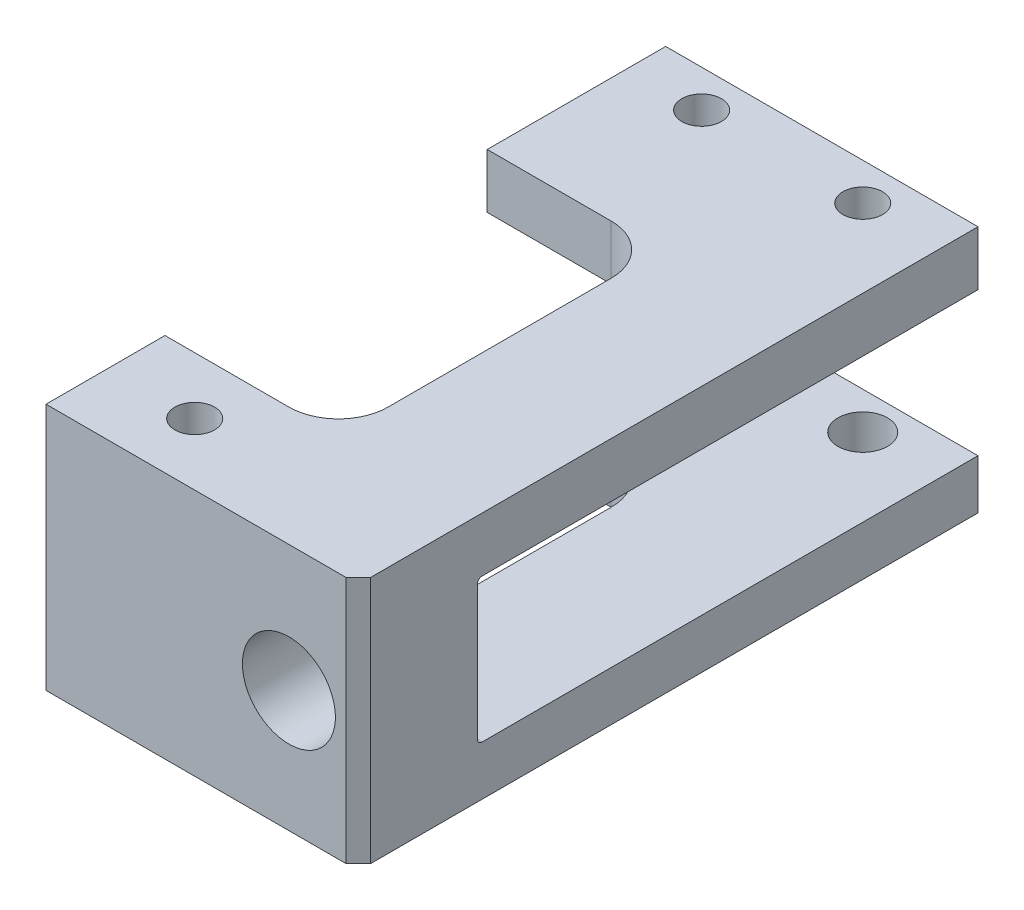
ISO-10303-21;
HEADER;
FILE_DESCRIPTION(('STEP AP214'),'2;1');
FILE_NAME('part.step','',(''),(''),'','','');
FILE_SCHEMA(('AUTOMOTIVE_DESIGN { 1 0 10303 214 1 1 1 1 }'));
ENDSEC;
DATA;
#1=APPLICATION_CONTEXT('core data for automotive mechanical design processes');
#2=APPLICATION_PROTOCOL_DEFINITION('international standard','automotive_design',2000,#1);
#3=PRODUCT_CONTEXT('',#1,'mechanical');
#4=PRODUCT('Part','Part','',(#3));
#5=PRODUCT_RELATED_PRODUCT_CATEGORY('part','',(#4));
#6=PRODUCT_DEFINITION_FORMATION('','',#4);
#7=PRODUCT_DEFINITION_CONTEXT('part definition',#1,'design');
#8=PRODUCT_DEFINITION('design','',#6,#7);
#9=PRODUCT_DEFINITION_SHAPE('','',#8);
#10=(LENGTH_UNIT() NAMED_UNIT(*) SI_UNIT(.MILLI.,.METRE.));
#11=(NAMED_UNIT(*) PLANE_ANGLE_UNIT() SI_UNIT($,.RADIAN.));
#12=(NAMED_UNIT(*) SI_UNIT($,.STERADIAN.) SOLID_ANGLE_UNIT());
#13=UNCERTAINTY_MEASURE_WITH_UNIT(LENGTH_MEASURE(1.E-05),#10,'distance_accuracy_value','');
#14=(GEOMETRIC_REPRESENTATION_CONTEXT(3) GLOBAL_UNCERTAINTY_ASSIGNED_CONTEXT((#13)) GLOBAL_UNIT_ASSIGNED_CONTEXT((#10,
#11,#12)) REPRESENTATION_CONTEXT('',''));
#15=CARTESIAN_POINT('',(0.,0.,0.));
#16=DIRECTION('',(0.,0.,1.));
#17=DIRECTION('',(1.,0.,0.));
#18=AXIS2_PLACEMENT_3D('',#15,#16,#17);
#19=CARTESIAN_POINT('',(-2.8,10.,10.));
#20=DIRECTION('',(0.,1.,0.));
#21=DIRECTION('',(0.,0.,1.));
#22=AXIS2_PLACEMENT_3D('',#19,#20,#21);
#23=CYLINDRICAL_SURFACE('',#22,0.799999999999999);
#24=CARTESIAN_POINT('',(-2.8,10.,10.));
#25=DIRECTION('',(0.,1.,0.));
#26=DIRECTION('',(0.,0.,1.));
#27=AXIS2_PLACEMENT_3D('',#24,#25,#26);
#28=CIRCLE('',#27,0.799999999999999);
#29=CARTESIAN_POINT('',(-2.8,10.,10.8));
#30=VERTEX_POINT('',#29);
#31=EDGE_CURVE('E418',#30,#30,#28,.T.);
#32=ORIENTED_EDGE('',*,*,#31,.T.);
#33=EDGE_LOOP('',(#32));
#34=FACE_BOUND('',#33,.T.);
#35=CARTESIAN_POINT('',(-2.8,0.999999999999999,10.));
#36=DIRECTION('',(0.,-1.,0.));
#37=DIRECTION('',(0.,0.,-1.));
#38=AXIS2_PLACEMENT_3D('',#35,#36,#37);
#39=CIRCLE('',#38,0.799999999999999);
#40=CARTESIAN_POINT('',(-2.8,0.999999999999999,9.2));
#41=VERTEX_POINT('',#40);
#42=EDGE_CURVE('E42',#41,#41,#39,.F.);
#43=ORIENTED_EDGE('',*,*,#42,.F.);
#44=EDGE_LOOP('',(#43));
#45=FACE_BOUND('',#44,.T.);
#46=ADVANCED_FACE('F37',(#34,#45),#23,.F.);
#47=CARTESIAN_POINT('',(-6.3,10.,12.5));
#48=DIRECTION('',(1.,0.,0.));
#49=DIRECTION('',(0.,0.,-1.));
#50=AXIS2_PLACEMENT_3D('',#47,#48,#49);
#51=PLANE('',#50);
#52=DIRECTION('',(0.,0.,1.));
#53=VECTOR('',#52,1.);
#54=CARTESIAN_POINT('',(-6.3,10.,12.5));
#55=LINE('',#54,#53);
#56=CARTESIAN_POINT('',(-6.3,10.,7.7));
#57=VERTEX_POINT('',#56);
#58=CARTESIAN_POINT('',(-6.3,10.,12.5));
#59=VERTEX_POINT('',#58);
#60=EDGE_CURVE('E210',#57,#59,#55,.T.);
#61=ORIENTED_EDGE('',*,*,#60,.F.);
#62=DIRECTION('',(0.,-1.,0.));
#63=VECTOR('',#62,1.);
#64=CARTESIAN_POINT('',(-6.3,7.8,7.7));
#65=LINE('',#64,#63);
#66=CARTESIAN_POINT('',(-6.3,0.,7.7));
#67=VERTEX_POINT('',#66);
#68=EDGE_CURVE('E475',#57,#67,#65,.T.);
#69=ORIENTED_EDGE('',*,*,#68,.T.);
#70=DIRECTION('',(0.,0.,1.));
#71=VECTOR('',#70,1.);
#72=CARTESIAN_POINT('',(-6.3,0.,12.5));
#73=LINE('',#72,#71);
#74=CARTESIAN_POINT('',(-6.3,0.,12.5));
#75=VERTEX_POINT('',#74);
#76=EDGE_CURVE('E222',#67,#75,#73,.T.);
#77=ORIENTED_EDGE('',*,*,#76,.T.);
#78=DIRECTION('',(0.,-1.,0.));
#79=VECTOR('',#78,1.);
#80=CARTESIAN_POINT('',(-6.3,10.,12.5));
#81=LINE('',#80,#79);
#82=EDGE_CURVE('E212',#59,#75,#81,.T.);
#83=ORIENTED_EDGE('',*,*,#82,.F.);
#84=EDGE_LOOP('',(#61,#69,#77,#83));
#85=FACE_BOUND('',#84,.T.);
#86=ADVANCED_FACE('F346',(#85),#51,.F.);
#87=CARTESIAN_POINT('',(-6.3,0.,-12.5));
#88=VERTEX_POINT('',#87);
#89=CARTESIAN_POINT('',(-6.3,0.,-5.3));
#90=VERTEX_POINT('',#89);
#91=EDGE_CURVE('E223',#88,#90,#73,.T.);
#92=ORIENTED_EDGE('',*,*,#91,.T.);
#93=DIRECTION('',(0.,1.,0.));
#94=VECTOR('',#93,1.);
#95=CARTESIAN_POINT('',(-6.3,0.,-5.3));
#96=LINE('',#95,#94);
#97=CARTESIAN_POINT('',(-6.3,2.,-5.3));
#98=VERTEX_POINT('',#97);
#99=EDGE_CURVE('E202',#90,#98,#96,.T.);
#100=ORIENTED_EDGE('',*,*,#99,.T.);
#101=DIRECTION('',(0.,0.,1.));
#102=VECTOR('',#101,1.);
#103=CARTESIAN_POINT('',(-6.3,2.,-12.5));
#104=LINE('',#103,#102);
#105=CARTESIAN_POINT('',(-6.3,2.,-12.5));
#106=VERTEX_POINT('',#105);
#107=EDGE_CURVE('E481',#106,#98,#104,.T.);
#108=ORIENTED_EDGE('',*,*,#107,.F.);
#109=DIRECTION('',(0.,-1.,0.));
#110=VECTOR('',#109,1.);
#111=CARTESIAN_POINT('',(-6.3,10.,-12.5));
#112=LINE('',#111,#110);
#113=EDGE_CURVE('E231',#106,#88,#112,.T.);
#114=ORIENTED_EDGE('',*,*,#113,.T.);
#115=EDGE_LOOP('',(#92,#100,#108,#114));
#116=FACE_BOUND('',#115,.T.);
#117=ADVANCED_FACE('F347',(#116),#51,.F.);
#118=CARTESIAN_POINT('',(-6.3,10.,-12.5));
#119=DIRECTION('',(0.,0.,1.));
#120=DIRECTION('',(1.,0.,0.));
#121=AXIS2_PLACEMENT_3D('',#118,#119,#120);
#122=PLANE('',#121);
#123=DIRECTION('',(0.,-1.,0.));
#124=VECTOR('',#123,1.);
#125=CARTESIAN_POINT('',(6.3,10.,-12.5));
#126=LINE('',#125,#124);
#127=CARTESIAN_POINT('',(6.3,10.,-12.5));
#128=VERTEX_POINT('',#127);
#129=CARTESIAN_POINT('',(6.3,7.8,-12.5));
#130=VERTEX_POINT('',#129);
#131=EDGE_CURVE('E235',#128,#130,#126,.T.);
#132=ORIENTED_EDGE('',*,*,#131,.T.);
#133=DIRECTION('',(-1.,0.,0.));
#134=VECTOR('',#133,1.);
#135=CARTESIAN_POINT('',(-6.3,7.8,-12.5));
#136=LINE('',#135,#134);
#137=CARTESIAN_POINT('',(-6.3,7.8,-12.5));
#138=VERTEX_POINT('',#137);
#139=EDGE_CURVE('E478',#130,#138,#136,.T.);
#140=ORIENTED_EDGE('',*,*,#139,.T.);
#141=CARTESIAN_POINT('',(-6.3,10.,-12.5));
#142=VERTEX_POINT('',#141);
#143=EDGE_CURVE('E232',#142,#138,#112,.T.);
#144=ORIENTED_EDGE('',*,*,#143,.F.);
#145=DIRECTION('',(-1.,0.,0.));
#146=VECTOR('',#145,1.);
#147=CARTESIAN_POINT('',(-6.3,10.,-12.5));
#148=LINE('',#147,#146);
#149=EDGE_CURVE('E207',#128,#142,#148,.T.);
#150=ORIENTED_EDGE('',*,*,#149,.F.);
#151=EDGE_LOOP('',(#132,#140,#144,#150));
#152=FACE_BOUND('',#151,.T.);
#153=ADVANCED_FACE('F338',(#152),#122,.F.);
#154=CARTESIAN_POINT('',(6.3,10.,12.5));
#155=DIRECTION('',(-1.,0.,0.));
#156=DIRECTION('',(0.,0.,1.));
#157=AXIS2_PLACEMENT_3D('',#154,#155,#156);
#158=PLANE('',#157);
#159=DIRECTION('',(0.,0.,-1.));
#160=VECTOR('',#159,1.);
#161=CARTESIAN_POINT('',(6.3,10.,12.5));
#162=LINE('',#161,#160);
#163=CARTESIAN_POINT('',(6.3,10.,12.));
#164=VERTEX_POINT('',#163);
#165=EDGE_CURVE('E228',#164,#128,#162,.T.);
#166=ORIENTED_EDGE('',*,*,#165,.F.);
#167=DIRECTION('',(0.,-1.,0.));
#168=VECTOR('',#167,1.);
#169=CARTESIAN_POINT('',(6.3,10.,12.));
#170=LINE('',#169,#168);
#171=CARTESIAN_POINT('',(6.3,0.,12.));
#172=VERTEX_POINT('',#171);
#173=EDGE_CURVE('E513',#164,#172,#170,.T.);
#174=ORIENTED_EDGE('',*,*,#173,.T.);
#175=DIRECTION('',(0.,0.,-1.));
#176=VECTOR('',#175,1.);
#177=CARTESIAN_POINT('',(6.3,0.,12.5));
#178=LINE('',#177,#176);
#179=CARTESIAN_POINT('',(6.3,0.,-12.5));
#180=VERTEX_POINT('',#179);
#181=EDGE_CURVE('E217',#172,#180,#178,.T.);
#182=ORIENTED_EDGE('',*,*,#181,.T.);
#183=CARTESIAN_POINT('',(6.3,2.,-12.5));
#184=VERTEX_POINT('',#183);
#185=EDGE_CURVE('E234',#184,#180,#126,.T.);
#186=ORIENTED_EDGE('',*,*,#185,.F.);
#187=DIRECTION('',(0.,0.,1.));
#188=VECTOR('',#187,1.);
#189=CARTESIAN_POINT('',(6.3,2.,-12.5));
#190=LINE('',#189,#188);
#191=CARTESIAN_POINT('',(6.3,2.,7.5));
#192=VERTEX_POINT('',#191);
#193=EDGE_CURVE('E459',#184,#192,#190,.T.);
#194=ORIENTED_EDGE('',*,*,#193,.T.);
#195=CARTESIAN_POINT('',(6.3,2.2,7.5));
#196=DIRECTION('',(-1.,0.,0.));
#197=DIRECTION('',(0.,0.,1.));
#198=AXIS2_PLACEMENT_3D('',#195,#196,#197);
#199=CIRCLE('',#198,0.2);
#200=CARTESIAN_POINT('',(6.3,2.2,7.7));
#201=VERTEX_POINT('',#200);
#202=EDGE_CURVE('E296',#192,#201,#199,.T.);
#203=ORIENTED_EDGE('',*,*,#202,.T.);
#204=DIRECTION('',(0.,1.,0.));
#205=VECTOR('',#204,1.);
#206=CARTESIAN_POINT('',(6.3,2.,7.7));
#207=LINE('',#206,#205);
#208=CARTESIAN_POINT('',(6.3,7.6,7.7));
#209=VERTEX_POINT('',#208);
#210=EDGE_CURVE('E470',#201,#209,#207,.T.);
#211=ORIENTED_EDGE('',*,*,#210,.T.);
#212=CARTESIAN_POINT('',(6.3,7.6,7.5));
#213=DIRECTION('',(-1.,0.,0.));
#214=DIRECTION('',(0.,0.,1.));
#215=AXIS2_PLACEMENT_3D('',#212,#213,#214);
#216=CIRCLE('',#215,0.2);
#217=CARTESIAN_POINT('',(6.3,7.8,7.5));
#218=VERTEX_POINT('',#217);
#219=EDGE_CURVE('E494',#209,#218,#216,.T.);
#220=ORIENTED_EDGE('',*,*,#219,.T.);
#221=DIRECTION('',(0.,0.,-1.));
#222=VECTOR('',#221,1.);
#223=CARTESIAN_POINT('',(6.3,7.8,-12.5));
#224=LINE('',#223,#222);
#225=EDGE_CURVE('E473',#218,#130,#224,.T.);
#226=ORIENTED_EDGE('',*,*,#225,.T.);
#227=ORIENTED_EDGE('',*,*,#131,.F.);
#228=EDGE_LOOP('',(#166,#174,#182,#186,#194,#203,#211,#220,#226,#227));
#229=FACE_BOUND('',#228,.T.);
#230=ADVANCED_FACE('F334',(#229),#158,.F.);
#231=DIRECTION('',(1.,0.,0.));
#232=VECTOR('',#231,1.);
#233=CARTESIAN_POINT('',(-6.3,2.,-12.5));
#234=LINE('',#233,#232);
#235=EDGE_CURVE('E476',#106,#184,#234,.T.);
#236=ORIENTED_EDGE('',*,*,#235,.T.);
#237=ORIENTED_EDGE('',*,*,#185,.T.);
#238=DIRECTION('',(-1.,0.,0.));
#239=VECTOR('',#238,1.);
#240=CARTESIAN_POINT('',(-6.3,0.,-12.5));
#241=LINE('',#240,#239);
#242=EDGE_CURVE('E219',#180,#88,#241,.T.);
#243=ORIENTED_EDGE('',*,*,#242,.T.);
#244=ORIENTED_EDGE('',*,*,#113,.F.);
#245=EDGE_LOOP('',(#236,#237,#243,#244));
#246=FACE_BOUND('',#245,.T.);
#247=ADVANCED_FACE('F337',(#246),#122,.F.);
#248=DIRECTION('',(0.,0.,1.));
#249=VECTOR('',#248,1.);
#250=CARTESIAN_POINT('',(-6.3,7.8,-12.5));
#251=LINE('',#250,#249);
#252=CARTESIAN_POINT('',(-6.3,7.8,-5.3));
#253=VERTEX_POINT('',#252);
#254=EDGE_CURVE('E201',#138,#253,#251,.T.);
#255=ORIENTED_EDGE('',*,*,#254,.T.);
#256=CARTESIAN_POINT('',(-6.3,10.,-5.3));
#257=VERTEX_POINT('',#256);
#258=EDGE_CURVE('E187',#253,#257,#96,.T.);
#259=ORIENTED_EDGE('',*,*,#258,.T.);
#260=EDGE_CURVE('E200',#142,#257,#55,.T.);
#261=ORIENTED_EDGE('',*,*,#260,.F.);
#262=ORIENTED_EDGE('',*,*,#143,.T.);
#263=EDGE_LOOP('',(#255,#259,#261,#262));
#264=FACE_BOUND('',#263,.T.);
#265=ADVANCED_FACE('F198',(#264),#51,.F.);
#266=CARTESIAN_POINT('',(-6.3,10.,12.5));
#267=DIRECTION('',(0.,0.,-1.));
#268=DIRECTION('',(-1.,0.,0.));
#269=AXIS2_PLACEMENT_3D('',#266,#267,#268);
#270=PLANE('',#269);
#271=CARTESIAN_POINT('',(3.5,4.9,12.5));
#272=DIRECTION('',(0.,0.,-1.));
#273=DIRECTION('',(-1.,0.,0.));
#274=AXIS2_PLACEMENT_3D('',#271,#272,#273);
#275=CIRCLE('',#274,1.875);
#276=CARTESIAN_POINT('',(1.625,4.9,12.5));
#277=VERTEX_POINT('',#276);
#278=EDGE_CURVE('E427',#277,#277,#275,.T.);
#279=ORIENTED_EDGE('',*,*,#278,.T.);
#280=EDGE_LOOP('',(#279));
#281=FACE_BOUND('',#280,.T.);
#282=DIRECTION('',(1.,0.,0.));
#283=VECTOR('',#282,1.);
#284=CARTESIAN_POINT('',(-6.3,0.,12.5));
#285=LINE('',#284,#283);
#286=CARTESIAN_POINT('',(5.8,0.,12.5));
#287=VERTEX_POINT('',#286);
#288=EDGE_CURVE('E226',#75,#287,#285,.T.);
#289=ORIENTED_EDGE('',*,*,#288,.T.);
#290=DIRECTION('',(0.,1.,0.));
#291=VECTOR('',#290,1.);
#292=CARTESIAN_POINT('',(5.8,10.,12.5));
#293=LINE('',#292,#291);
#294=CARTESIAN_POINT('',(5.8,10.,12.5));
#295=VERTEX_POINT('',#294);
#296=EDGE_CURVE('E47',#287,#295,#293,.T.);
#297=ORIENTED_EDGE('',*,*,#296,.T.);
#298=DIRECTION('',(1.,0.,0.));
#299=VECTOR('',#298,1.);
#300=CARTESIAN_POINT('',(-6.3,10.,12.5));
#301=LINE('',#300,#299);
#302=EDGE_CURVE('E209',#59,#295,#301,.T.);
#303=ORIENTED_EDGE('',*,*,#302,.F.);
#304=ORIENTED_EDGE('',*,*,#82,.T.);
#305=EDGE_LOOP('',(#289,#297,#303,#304));
#306=FACE_BOUND('',#305,.T.);
#307=ADVANCED_FACE('F345',(#281,#306),#270,.F.);
#308=CARTESIAN_POINT('',(0.,10.,0.));
#309=DIRECTION('',(0.,-1.,0.));
#310=DIRECTION('',(0.,0.,-1.));
#311=AXIS2_PLACEMENT_3D('',#308,#309,#310);
#312=PLANE('',#311);
#313=ORIENTED_EDGE('',*,*,#31,.F.);
#314=EDGE_LOOP('',(#313));
#315=FACE_BOUND('',#314,.T.);
#316=CARTESIAN_POINT('',(3.15,10.,-11.));
#317=DIRECTION('',(0.,1.,0.));
#318=DIRECTION('',(0.,0.,1.));
#319=AXIS2_PLACEMENT_3D('',#316,#317,#318);
#320=CIRCLE('',#319,0.799999999999988);
#321=CARTESIAN_POINT('',(3.15,10.,-10.2));
#322=VERTEX_POINT('',#321);
#323=EDGE_CURVE('E247',#322,#322,#320,.T.);
#324=ORIENTED_EDGE('',*,*,#323,.F.);
#325=EDGE_LOOP('',(#324));
#326=FACE_BOUND('',#325,.T.);
#327=CARTESIAN_POINT('',(-3.35,10.,-11.));
#328=DIRECTION('',(0.,1.,0.));
#329=DIRECTION('',(0.,0.,1.));
#330=AXIS2_PLACEMENT_3D('',#327,#328,#329);
#331=CIRCLE('',#330,0.799999999999988);
#332=CARTESIAN_POINT('',(-3.35,10.,-10.2));
#333=VERTEX_POINT('',#332);
#334=EDGE_CURVE('E243',#333,#333,#331,.T.);
#335=ORIENTED_EDGE('',*,*,#334,.F.);
#336=EDGE_LOOP('',(#335));
#337=FACE_BOUND('',#336,.T.);
#338=ORIENTED_EDGE('',*,*,#302,.T.);
#339=DIRECTION('',(-0.707106781186548,0.,0.707106781186548));
#340=VECTOR('',#339,1.);
#341=CARTESIAN_POINT('',(6.3,10.,12.));
#342=LINE('',#341,#340);
#343=EDGE_CURVE('E11',#295,#164,#342,.F.);
#344=ORIENTED_EDGE('',*,*,#343,.T.);
#345=ORIENTED_EDGE('',*,*,#165,.T.);
#346=ORIENTED_EDGE('',*,*,#149,.T.);
#347=ORIENTED_EDGE('',*,*,#260,.T.);
#348=DIRECTION('',(-1.,0.,0.));
#349=VECTOR('',#348,1.);
#350=CARTESIAN_POINT('',(0.700000000000002,10.,-5.3));
#351=LINE('',#350,#349);
#352=CARTESIAN_POINT('',(-1.3,10.,-5.3));
#353=VERTEX_POINT('',#352);
#354=EDGE_CURVE('E183',#353,#257,#351,.T.);
#355=ORIENTED_EDGE('',*,*,#354,.F.);
#356=CARTESIAN_POINT('',(-1.3,10.,-3.3));
#357=DIRECTION('',(0.,-1.,0.));
#358=DIRECTION('',(0.,0.,-1.));
#359=AXIS2_PLACEMENT_3D('',#356,#357,#358);
#360=CIRCLE('',#359,2.);
#361=CARTESIAN_POINT('',(0.700000000000002,10.,-3.29999999999999));
#362=VERTEX_POINT('',#361);
#363=EDGE_CURVE('E268',#353,#362,#360,.T.);
#364=ORIENTED_EDGE('',*,*,#363,.T.);
#365=DIRECTION('',(0.,0.,-1.));
#366=VECTOR('',#365,1.);
#367=CARTESIAN_POINT('',(0.700000000000001,10.,7.7));
#368=LINE('',#367,#366);
#369=CARTESIAN_POINT('',(0.700000000000001,10.,5.7));
#370=VERTEX_POINT('',#369);
#371=EDGE_CURVE('E194',#370,#362,#368,.T.);
#372=ORIENTED_EDGE('',*,*,#371,.F.);
#373=CARTESIAN_POINT('',(-1.3,10.,5.7));
#374=DIRECTION('',(0.,-1.,0.));
#375=DIRECTION('',(0.,0.,-1.));
#376=AXIS2_PLACEMENT_3D('',#373,#374,#375);
#377=CIRCLE('',#376,2.);
#378=CARTESIAN_POINT('',(-1.3,10.,7.7));
#379=VERTEX_POINT('',#378);
#380=EDGE_CURVE('E272',#370,#379,#377,.T.);
#381=ORIENTED_EDGE('',*,*,#380,.T.);
#382=DIRECTION('',(1.,0.,0.));
#383=VECTOR('',#382,1.);
#384=CARTESIAN_POINT('',(0.700000000000001,10.,7.7));
#385=LINE('',#384,#383);
#386=EDGE_CURVE('E193',#57,#379,#385,.T.);
#387=ORIENTED_EDGE('',*,*,#386,.F.);
#388=ORIENTED_EDGE('',*,*,#60,.T.);
#389=EDGE_LOOP('',(#338,#344,#345,#346,#347,#355,#364,#372,#381,#387,#388));
#390=FACE_BOUND('',#389,.T.);
#391=ADVANCED_FACE('F205',(#315,#326,#337,#390),#312,.F.);
#392=CARTESIAN_POINT('',(0.,0.,0.));
#393=DIRECTION('',(0.,-1.,0.));
#394=DIRECTION('',(0.,0.,-1.));
#395=AXIS2_PLACEMENT_3D('',#392,#393,#394);
#396=PLANE('',#395);
#397=CARTESIAN_POINT('',(-2.8,0.,10.));
#398=DIRECTION('',(0.,-1.,0.));
#399=DIRECTION('',(0.,0.,-1.));
#400=AXIS2_PLACEMENT_3D('',#397,#398,#399);
#401=CIRCLE('',#400,1.5);
#402=CARTESIAN_POINT('',(-2.8,0.,8.5));
#403=VERTEX_POINT('',#402);
#404=EDGE_CURVE('E422',#403,#403,#401,.T.);
#405=ORIENTED_EDGE('',*,*,#404,.F.);
#406=EDGE_LOOP('',(#405));
#407=FACE_BOUND('',#406,.T.);
#408=ORIENTED_EDGE('',*,*,#181,.F.);
#409=DIRECTION('',(0.707106781186548,0.,-0.707106781186548));
#410=VECTOR('',#409,1.);
#411=CARTESIAN_POINT('',(9.15,0.,9.15));
#412=LINE('',#411,#410);
#413=EDGE_CURVE('E61',#172,#287,#412,.F.);
#414=ORIENTED_EDGE('',*,*,#413,.T.);
#415=ORIENTED_EDGE('',*,*,#288,.F.);
#416=ORIENTED_EDGE('',*,*,#76,.F.);
#417=DIRECTION('',(1.,0.,0.));
#418=VECTOR('',#417,1.);
#419=CARTESIAN_POINT('',(0.700000000000001,0.,7.7));
#420=LINE('',#419,#418);
#421=CARTESIAN_POINT('',(-1.3,0.,7.7));
#422=VERTEX_POINT('',#421);
#423=EDGE_CURVE('E203',#67,#422,#420,.T.);
#424=ORIENTED_EDGE('',*,*,#423,.T.);
#425=CARTESIAN_POINT('',(-1.3,0.,5.7));
#426=DIRECTION('',(0.,-1.,0.));
#427=DIRECTION('',(0.,0.,-1.));
#428=AXIS2_PLACEMENT_3D('',#425,#426,#427);
#429=CIRCLE('',#428,2.);
#430=CARTESIAN_POINT('',(0.700000000000001,0.,5.7));
#431=VERTEX_POINT('',#430);
#432=EDGE_CURVE('E283',#422,#431,#429,.F.);
#433=ORIENTED_EDGE('',*,*,#432,.T.);
#434=DIRECTION('',(0.,0.,-1.));
#435=VECTOR('',#434,1.);
#436=CARTESIAN_POINT('',(0.700000000000001,0.,7.7));
#437=LINE('',#436,#435);
#438=CARTESIAN_POINT('',(0.700000000000002,0.,-3.29999999999999));
#439=VERTEX_POINT('',#438);
#440=EDGE_CURVE('E436',#431,#439,#437,.T.);
#441=ORIENTED_EDGE('',*,*,#440,.T.);
#442=CARTESIAN_POINT('',(-1.3,0.,-3.3));
#443=DIRECTION('',(0.,-1.,0.));
#444=DIRECTION('',(0.,0.,-1.));
#445=AXIS2_PLACEMENT_3D('',#442,#443,#444);
#446=CIRCLE('',#445,2.);
#447=CARTESIAN_POINT('',(-1.3,0.,-5.3));
#448=VERTEX_POINT('',#447);
#449=EDGE_CURVE('E278',#439,#448,#446,.F.);
#450=ORIENTED_EDGE('',*,*,#449,.T.);
#451=DIRECTION('',(-1.,0.,0.));
#452=VECTOR('',#451,1.);
#453=CARTESIAN_POINT('',(0.700000000000002,0.,-5.3));
#454=LINE('',#453,#452);
#455=EDGE_CURVE('E439',#448,#90,#454,.T.);
#456=ORIENTED_EDGE('',*,*,#455,.T.);
#457=ORIENTED_EDGE('',*,*,#91,.F.);
#458=ORIENTED_EDGE('',*,*,#242,.F.);
#459=EDGE_LOOP('',(#408,#414,#415,#416,#424,#433,#441,#450,#456,#457,#458));
#460=FACE_BOUND('',#459,.T.);
#461=CARTESIAN_POINT('',(3.15,0.,-11.));
#462=DIRECTION('',(0.,1.,0.));
#463=DIRECTION('',(0.,0.,1.));
#464=AXIS2_PLACEMENT_3D('',#461,#462,#463);
#465=CIRCLE('',#464,1.);
#466=CARTESIAN_POINT('',(3.15,0.,-10.));
#467=VERTEX_POINT('',#466);
#468=EDGE_CURVE('E456',#467,#467,#465,.T.);
#469=ORIENTED_EDGE('',*,*,#468,.T.);
#470=EDGE_LOOP('',(#469));
#471=FACE_BOUND('',#470,.T.);
#472=CARTESIAN_POINT('',(-3.35,0.,-11.));
#473=DIRECTION('',(0.,1.,0.));
#474=DIRECTION('',(0.,0.,1.));
#475=AXIS2_PLACEMENT_3D('',#472,#473,#474);
#476=CIRCLE('',#475,1.);
#477=CARTESIAN_POINT('',(-3.35,0.,-10.));
#478=VERTEX_POINT('',#477);
#479=EDGE_CURVE('E463',#478,#478,#476,.T.);
#480=ORIENTED_EDGE('',*,*,#479,.T.);
#481=EDGE_LOOP('',(#480));
#482=FACE_BOUND('',#481,.T.);
#483=ADVANCED_FACE('F351',(#407,#460,#471,#482),#396,.T.);
#484=CARTESIAN_POINT('',(-6.3,7.8,-12.5));
#485=DIRECTION('',(0.,1.,0.));
#486=DIRECTION('',(0.,0.,1.));
#487=AXIS2_PLACEMENT_3D('',#484,#485,#486);
#488=PLANE('',#487);
#489=CARTESIAN_POINT('',(3.15,7.8,-11.));
#490=DIRECTION('',(0.,1.,0.));
#491=DIRECTION('',(0.,0.,1.));
#492=AXIS2_PLACEMENT_3D('',#489,#490,#491);
#493=CIRCLE('',#492,0.799999999999993);
#494=CARTESIAN_POINT('',(3.15,7.8,-10.2));
#495=VERTEX_POINT('',#494);
#496=EDGE_CURVE('E244',#495,#495,#493,.T.);
#497=ORIENTED_EDGE('',*,*,#496,.T.);
#498=EDGE_LOOP('',(#497));
#499=FACE_BOUND('',#498,.T.);
#500=CARTESIAN_POINT('',(-3.35,7.8,-11.));
#501=DIRECTION('',(0.,1.,0.));
#502=DIRECTION('',(0.,0.,1.));
#503=AXIS2_PLACEMENT_3D('',#500,#501,#502);
#504=CIRCLE('',#503,0.799999999999993);
#505=CARTESIAN_POINT('',(-3.35,7.8,-10.2));
#506=VERTEX_POINT('',#505);
#507=EDGE_CURVE('E239',#506,#506,#504,.T.);
#508=ORIENTED_EDGE('',*,*,#507,.T.);
#509=EDGE_LOOP('',(#508));
#510=FACE_BOUND('',#509,.T.);
#511=ORIENTED_EDGE('',*,*,#225,.F.);
#512=DIRECTION('',(-1.,0.,0.));
#513=VECTOR('',#512,1.);
#514=CARTESIAN_POINT('',(-1.3,7.8,7.5));
#515=LINE('',#514,#513);
#516=CARTESIAN_POINT('',(-0.428220211291869,7.8,7.5));
#517=VERTEX_POINT('',#516);
#518=EDGE_CURVE('E293',#218,#517,#515,.T.);
#519=ORIENTED_EDGE('',*,*,#518,.T.);
#520=CARTESIAN_POINT('',(-1.3,7.8,5.7));
#521=DIRECTION('',(0.,1.,0.));
#522=DIRECTION('',(0.,0.,1.));
#523=AXIS2_PLACEMENT_3D('',#520,#521,#522);
#524=CIRCLE('',#523,2.);
#525=CARTESIAN_POINT('',(0.700000000000001,7.8,5.7));
#526=VERTEX_POINT('',#525);
#527=EDGE_CURVE('E274',#517,#526,#524,.T.);
#528=ORIENTED_EDGE('',*,*,#527,.T.);
#529=DIRECTION('',(0.,0.,-1.));
#530=VECTOR('',#529,1.);
#531=CARTESIAN_POINT('',(0.700000000000002,7.8,-12.5));
#532=LINE('',#531,#530);
#533=CARTESIAN_POINT('',(0.700000000000001,7.8,-3.3));
#534=VERTEX_POINT('',#533);
#535=EDGE_CURVE('E447',#526,#534,#532,.T.);
#536=ORIENTED_EDGE('',*,*,#535,.T.);
#537=CARTESIAN_POINT('',(-1.3,7.8,-3.3));
#538=DIRECTION('',(0.,1.,0.));
#539=DIRECTION('',(0.,0.,1.));
#540=AXIS2_PLACEMENT_3D('',#537,#538,#539);
#541=CIRCLE('',#540,2.);
#542=CARTESIAN_POINT('',(-1.3,7.8,-5.3));
#543=VERTEX_POINT('',#542);
#544=EDGE_CURVE('E270',#534,#543,#541,.T.);
#545=ORIENTED_EDGE('',*,*,#544,.T.);
#546=DIRECTION('',(-1.,0.,0.));
#547=VECTOR('',#546,1.);
#548=CARTESIAN_POINT('',(-6.3,7.8,-5.3));
#549=LINE('',#548,#547);
#550=EDGE_CURVE('E450',#543,#253,#549,.T.);
#551=ORIENTED_EDGE('',*,*,#550,.T.);
#552=ORIENTED_EDGE('',*,*,#254,.F.);
#553=ORIENTED_EDGE('',*,*,#139,.F.);
#554=EDGE_LOOP('',(#511,#519,#528,#536,#545,#551,#552,#553));
#555=FACE_BOUND('',#554,.T.);
#556=ADVANCED_FACE('F354',(#499,#510,#555),#488,.F.);
#557=CARTESIAN_POINT('',(-6.3,2.,-12.5));
#558=DIRECTION('',(0.,-1.,0.));
#559=DIRECTION('',(0.,0.,-1.));
#560=AXIS2_PLACEMENT_3D('',#557,#558,#559);
#561=PLANE('',#560);
#562=CARTESIAN_POINT('',(3.15,2.,-11.));
#563=DIRECTION('',(0.,1.,0.));
#564=DIRECTION('',(0.,0.,1.));
#565=AXIS2_PLACEMENT_3D('',#562,#563,#564);
#566=CIRCLE('',#565,1.);
#567=CARTESIAN_POINT('',(3.15,2.,-10.));
#568=VERTEX_POINT('',#567);
#569=EDGE_CURVE('E460',#568,#568,#566,.T.);
#570=ORIENTED_EDGE('',*,*,#569,.F.);
#571=EDGE_LOOP('',(#570));
#572=FACE_BOUND('',#571,.T.);
#573=CARTESIAN_POINT('',(-3.35,2.,-11.));
#574=DIRECTION('',(0.,1.,0.));
#575=DIRECTION('',(0.,0.,1.));
#576=AXIS2_PLACEMENT_3D('',#573,#574,#575);
#577=CIRCLE('',#576,1.);
#578=CARTESIAN_POINT('',(-3.35,2.,-10.));
#579=VERTEX_POINT('',#578);
#580=EDGE_CURVE('E242',#579,#579,#577,.T.);
#581=ORIENTED_EDGE('',*,*,#580,.F.);
#582=EDGE_LOOP('',(#581));
#583=FACE_BOUND('',#582,.T.);
#584=CARTESIAN_POINT('',(-1.3,2.,5.7));
#585=DIRECTION('',(0.,-1.,0.));
#586=DIRECTION('',(0.,0.,-1.));
#587=AXIS2_PLACEMENT_3D('',#584,#585,#586);
#588=CIRCLE('',#587,2.);
#589=CARTESIAN_POINT('',(0.700000000000001,2.,5.7));
#590=VERTEX_POINT('',#589);
#591=CARTESIAN_POINT('',(-0.428220211291869,2.,7.5));
#592=VERTEX_POINT('',#591);
#593=EDGE_CURVE('E280',#590,#592,#588,.T.);
#594=ORIENTED_EDGE('',*,*,#593,.T.);
#595=DIRECTION('',(1.,0.,0.));
#596=VECTOR('',#595,1.);
#597=CARTESIAN_POINT('',(6.3,2.,7.5));
#598=LINE('',#597,#596);
#599=EDGE_CURVE('E285',#592,#192,#598,.T.);
#600=ORIENTED_EDGE('',*,*,#599,.T.);
#601=ORIENTED_EDGE('',*,*,#193,.F.);
#602=ORIENTED_EDGE('',*,*,#235,.F.);
#603=ORIENTED_EDGE('',*,*,#107,.T.);
#604=DIRECTION('',(1.,0.,0.));
#605=VECTOR('',#604,1.);
#606=CARTESIAN_POINT('',(-6.3,2.,-5.3));
#607=LINE('',#606,#605);
#608=CARTESIAN_POINT('',(-1.3,2.,-5.3));
#609=VERTEX_POINT('',#608);
#610=EDGE_CURVE('E238',#98,#609,#607,.T.);
#611=ORIENTED_EDGE('',*,*,#610,.T.);
#612=CARTESIAN_POINT('',(-1.3,2.,-3.3));
#613=DIRECTION('',(0.,-1.,0.));
#614=DIRECTION('',(0.,0.,-1.));
#615=AXIS2_PLACEMENT_3D('',#612,#613,#614);
#616=CIRCLE('',#615,2.);
#617=CARTESIAN_POINT('',(0.700000000000001,2.,-3.3));
#618=VERTEX_POINT('',#617);
#619=EDGE_CURVE('E276',#609,#618,#616,.T.);
#620=ORIENTED_EDGE('',*,*,#619,.T.);
#621=DIRECTION('',(0.,0.,1.));
#622=VECTOR('',#621,1.);
#623=CARTESIAN_POINT('',(0.700000000000002,2.,-12.5));
#624=LINE('',#623,#622);
#625=EDGE_CURVE('E444',#618,#590,#624,.T.);
#626=ORIENTED_EDGE('',*,*,#625,.T.);
#627=EDGE_LOOP('',(#594,#600,#601,#602,#603,#611,#620,#626));
#628=FACE_BOUND('',#627,.T.);
#629=ADVANCED_FACE('F359',(#572,#583,#628),#561,.F.);
#630=CARTESIAN_POINT('',(0.,0.,7.7));
#631=DIRECTION('',(0.,0.,1.));
#632=DIRECTION('',(1.,0.,0.));
#633=AXIS2_PLACEMENT_3D('',#630,#631,#632);
#634=PLANE('',#633);
#635=CARTESIAN_POINT('',(3.5,4.9,7.7));
#636=DIRECTION('',(0.,0.,-1.));
#637=DIRECTION('',(-1.,0.,0.));
#638=AXIS2_PLACEMENT_3D('',#635,#636,#637);
#639=CIRCLE('',#638,1.875);
#640=CARTESIAN_POINT('',(1.625,4.9,7.7));
#641=VERTEX_POINT('',#640);
#642=EDGE_CURVE('E420',#641,#641,#639,.T.);
#643=ORIENTED_EDGE('',*,*,#642,.F.);
#644=EDGE_LOOP('',(#643));
#645=FACE_BOUND('',#644,.T.);
#646=ORIENTED_EDGE('',*,*,#210,.F.);
#647=DIRECTION('',(1.,0.,0.));
#648=VECTOR('',#647,1.);
#649=CARTESIAN_POINT('',(-1.3,2.2,7.7));
#650=LINE('',#649,#648);
#651=CARTESIAN_POINT('',(-1.3,2.2,7.7));
#652=VERTEX_POINT('',#651);
#653=EDGE_CURVE('E290',#201,#652,#650,.F.);
#654=ORIENTED_EDGE('',*,*,#653,.T.);
#655=DIRECTION('',(0.,1.,0.));
#656=VECTOR('',#655,1.);
#657=CARTESIAN_POINT('',(-1.3,0.,7.7));
#658=LINE('',#657,#656);
#659=EDGE_CURVE('E256',#652,#422,#658,.F.);
#660=ORIENTED_EDGE('',*,*,#659,.T.);
#661=ORIENTED_EDGE('',*,*,#423,.F.);
#662=ORIENTED_EDGE('',*,*,#68,.F.);
#663=ORIENTED_EDGE('',*,*,#386,.T.);
#664=DIRECTION('',(0.,1.,0.));
#665=VECTOR('',#664,1.);
#666=CARTESIAN_POINT('',(-1.3,7.8,7.7));
#667=LINE('',#666,#665);
#668=CARTESIAN_POINT('',(-1.3,7.6,7.7));
#669=VERTEX_POINT('',#668);
#670=EDGE_CURVE('E258',#379,#669,#667,.F.);
#671=ORIENTED_EDGE('',*,*,#670,.T.);
#672=DIRECTION('',(-1.,0.,0.));
#673=VECTOR('',#672,1.);
#674=CARTESIAN_POINT('',(6.3,7.6,7.7));
#675=LINE('',#674,#673);
#676=EDGE_CURVE('E288',#669,#209,#675,.F.);
#677=ORIENTED_EDGE('',*,*,#676,.T.);
#678=EDGE_LOOP('',(#646,#654,#660,#661,#662,#663,#671,#677));
#679=FACE_BOUND('',#678,.T.);
#680=ADVANCED_FACE('F362',(#645,#679),#634,.F.);
#681=CARTESIAN_POINT('',(-3.35,0.,-11.));
#682=DIRECTION('',(0.,1.,0.));
#683=DIRECTION('',(0.,0.,1.));
#684=AXIS2_PLACEMENT_3D('',#681,#682,#683);
#685=CYLINDRICAL_SURFACE('',#684,1.);
#686=ORIENTED_EDGE('',*,*,#479,.F.);
#687=EDGE_LOOP('',(#686));
#688=FACE_BOUND('',#687,.T.);
#689=ORIENTED_EDGE('',*,*,#580,.T.);
#690=EDGE_LOOP('',(#689));
#691=FACE_BOUND('',#690,.T.);
#692=ADVANCED_FACE('F369',(#688,#691),#685,.F.);
#693=CARTESIAN_POINT('',(3.15,0.,-11.));
#694=DIRECTION('',(0.,1.,0.));
#695=DIRECTION('',(0.,0.,1.));
#696=AXIS2_PLACEMENT_3D('',#693,#694,#695);
#697=CYLINDRICAL_SURFACE('',#696,1.);
#698=ORIENTED_EDGE('',*,*,#468,.F.);
#699=EDGE_LOOP('',(#698));
#700=FACE_BOUND('',#699,.T.);
#701=ORIENTED_EDGE('',*,*,#569,.T.);
#702=EDGE_LOOP('',(#701));
#703=FACE_BOUND('',#702,.T.);
#704=ADVANCED_FACE('F373',(#700,#703),#697,.F.);
#705=CARTESIAN_POINT('',(-3.35,10.,-11.));
#706=DIRECTION('',(0.,1.,0.));
#707=DIRECTION('',(0.,0.,1.));
#708=AXIS2_PLACEMENT_3D('',#705,#706,#707);
#709=CYLINDRICAL_SURFACE('',#708,0.799999999999993);
#710=ORIENTED_EDGE('',*,*,#334,.T.);
#711=EDGE_LOOP('',(#710));
#712=FACE_BOUND('',#711,.T.);
#713=ORIENTED_EDGE('',*,*,#507,.F.);
#714=EDGE_LOOP('',(#713));
#715=FACE_BOUND('',#714,.T.);
#716=ADVANCED_FACE('F377',(#712,#715),#709,.F.);
#717=CARTESIAN_POINT('',(3.15,10.,-11.));
#718=DIRECTION('',(0.,1.,0.));
#719=DIRECTION('',(0.,0.,1.));
#720=AXIS2_PLACEMENT_3D('',#717,#718,#719);
#721=CYLINDRICAL_SURFACE('',#720,0.799999999999993);
#722=ORIENTED_EDGE('',*,*,#323,.T.);
#723=EDGE_LOOP('',(#722));
#724=FACE_BOUND('',#723,.T.);
#725=ORIENTED_EDGE('',*,*,#496,.F.);
#726=EDGE_LOOP('',(#725));
#727=FACE_BOUND('',#726,.T.);
#728=ADVANCED_FACE('F381',(#724,#727),#721,.F.);
#729=CARTESIAN_POINT('',(0.700000000000002,0.,-5.3));
#730=DIRECTION('',(0.,0.,-1.));
#731=DIRECTION('',(-1.,0.,0.));
#732=AXIS2_PLACEMENT_3D('',#729,#730,#731);
#733=PLANE('',#732);
#734=ORIENTED_EDGE('',*,*,#455,.F.);
#735=DIRECTION('',(0.,1.,0.));
#736=VECTOR('',#735,1.);
#737=CARTESIAN_POINT('',(-1.3,2.,-5.3));
#738=LINE('',#737,#736);
#739=EDGE_CURVE('E260',#448,#609,#738,.T.);
#740=ORIENTED_EDGE('',*,*,#739,.T.);
#741=ORIENTED_EDGE('',*,*,#610,.F.);
#742=ORIENTED_EDGE('',*,*,#99,.F.);
#743=EDGE_LOOP('',(#734,#740,#741,#742));
#744=FACE_BOUND('',#743,.T.);
#745=ADVANCED_FACE('F385',(#744),#733,.F.);
#746=CARTESIAN_POINT('',(0.700000000000001,0.,7.7));
#747=DIRECTION('',(1.,0.,0.));
#748=DIRECTION('',(0.,0.,-1.));
#749=AXIS2_PLACEMENT_3D('',#746,#747,#748);
#750=PLANE('',#749);
#751=ORIENTED_EDGE('',*,*,#625,.F.);
#752=DIRECTION('',(0.,1.,0.));
#753=VECTOR('',#752,1.);
#754=CARTESIAN_POINT('',(0.700000000000002,0.,-3.3));
#755=LINE('',#754,#753);
#756=EDGE_CURVE('E266',#618,#439,#755,.F.);
#757=ORIENTED_EDGE('',*,*,#756,.T.);
#758=ORIENTED_EDGE('',*,*,#440,.F.);
#759=DIRECTION('',(0.,1.,0.));
#760=VECTOR('',#759,1.);
#761=CARTESIAN_POINT('',(0.700000000000001,2.,5.7));
#762=LINE('',#761,#760);
#763=EDGE_CURVE('E263',#431,#590,#762,.T.);
#764=ORIENTED_EDGE('',*,*,#763,.T.);
#765=EDGE_LOOP('',(#751,#757,#758,#764));
#766=FACE_BOUND('',#765,.T.);
#767=ADVANCED_FACE('F390',(#766),#750,.F.);
#768=ORIENTED_EDGE('',*,*,#550,.F.);
#769=DIRECTION('',(0.,1.,0.));
#770=VECTOR('',#769,1.);
#771=CARTESIAN_POINT('',(-1.3,10.,-5.3));
#772=LINE('',#771,#770);
#773=EDGE_CURVE('E190',#543,#353,#772,.T.);
#774=ORIENTED_EDGE('',*,*,#773,.T.);
#775=ORIENTED_EDGE('',*,*,#354,.T.);
#776=ORIENTED_EDGE('',*,*,#258,.F.);
#777=EDGE_LOOP('',(#768,#774,#775,#776));
#778=FACE_BOUND('',#777,.T.);
#779=ADVANCED_FACE('F186',(#778),#733,.F.);
#780=ORIENTED_EDGE('',*,*,#371,.T.);
#781=DIRECTION('',(0.,1.,0.));
#782=VECTOR('',#781,1.);
#783=CARTESIAN_POINT('',(0.700000000000002,7.8,-3.3));
#784=LINE('',#783,#782);
#785=EDGE_CURVE('E254',#362,#534,#784,.F.);
#786=ORIENTED_EDGE('',*,*,#785,.T.);
#787=ORIENTED_EDGE('',*,*,#535,.F.);
#788=DIRECTION('',(0.,1.,0.));
#789=VECTOR('',#788,1.);
#790=CARTESIAN_POINT('',(0.700000000000001,10.,5.7));
#791=LINE('',#790,#789);
#792=EDGE_CURVE('E251',#526,#370,#791,.T.);
#793=ORIENTED_EDGE('',*,*,#792,.T.);
#794=EDGE_LOOP('',(#780,#786,#787,#793));
#795=FACE_BOUND('',#794,.T.);
#796=ADVANCED_FACE('F332',(#795),#750,.F.);
#797=CARTESIAN_POINT('',(-1.3,0.,-3.3));
#798=DIRECTION('',(0.,-1.,0.));
#799=DIRECTION('',(0.,0.,-1.));
#800=AXIS2_PLACEMENT_3D('',#797,#798,#799);
#801=CYLINDRICAL_SURFACE('',#800,2.);
#802=ORIENTED_EDGE('',*,*,#544,.F.);
#803=ORIENTED_EDGE('',*,*,#785,.F.);
#804=ORIENTED_EDGE('',*,*,#363,.F.);
#805=ORIENTED_EDGE('',*,*,#773,.F.);
#806=EDGE_LOOP('',(#802,#803,#804,#805));
#807=FACE_BOUND('',#806,.T.);
#808=ADVANCED_FACE('F328',(#807),#801,.F.);
#809=CARTESIAN_POINT('',(-1.3,0.,5.7));
#810=DIRECTION('',(0.,-1.,0.));
#811=DIRECTION('',(0.,0.,-1.));
#812=AXIS2_PLACEMENT_3D('',#809,#810,#811);
#813=CYLINDRICAL_SURFACE('',#812,2.);
#814=ORIENTED_EDGE('',*,*,#527,.F.);
#815=CARTESIAN_POINT('',(-0.428220211291869,7.8,7.5));
#816=CARTESIAN_POINT('',(-0.45715973805367,7.79996175848643,7.51401989347998));
#817=CARTESIAN_POINT('',(-0.486397643908612,7.79853097766287,7.52731514344287));
#818=CARTESIAN_POINT('',(-0.545259573796734,7.79344547447464,7.55239964672805));
#819=CARTESIAN_POINT('',(-0.574882700443705,7.78979524201771,7.56419188251238));
#820=CARTESIAN_POINT('',(-0.634300425359317,7.78084569659502,7.5862252177533));
#821=CARTESIAN_POINT('',(-0.664093824432566,7.77555319891199,7.59647247231074));
#822=CARTESIAN_POINT('',(-0.723907072855265,7.76366928600009,7.61549003734659));
#823=CARTESIAN_POINT('',(-0.753927054696698,7.75707704322899,7.62425940022533));
#824=CARTESIAN_POINT('',(-0.867852036408319,7.73025957335495,7.65468099468993));
#825=CARTESIAN_POINT('',(-0.952320236739531,7.70669847567466,7.67139796247726));
#826=CARTESIAN_POINT('',(-1.1217045940587,7.65633312825506,7.69387001418937));
#827=CARTESIAN_POINT('',(-1.20662092710591,7.62952749641819,7.69962040900359));
#828=CARTESIAN_POINT('',(-1.29431471388528,7.60179784190903,7.69999392629444));
#829=CARTESIAN_POINT('',(-1.29715739869525,7.60089890510664,7.6999999857086));
#830=CARTESIAN_POINT('',(-1.3,7.6,7.7));
#831=B_SPLINE_CURVE_WITH_KNOTS('',3,(#815,#816,#817,#818,#819,#820,#821,#822,#823,#824,#825,
#826,#827,#828,#829,#830),.UNSPECIFIED.,.F.,.F.,(4,2,2,2,2,2,2,4),(0.,0.0963647872284005,
0.192535275967189,0.288311884280232,0.384149671235461,0.651005986217638,0.917976378629925,
0.926920669114513),.UNSPECIFIED.);
#832=EDGE_CURVE('E306',#517,#669,#831,.T.);
#833=ORIENTED_EDGE('',*,*,#832,.T.);
#834=ORIENTED_EDGE('',*,*,#670,.F.);
#835=ORIENTED_EDGE('',*,*,#380,.F.);
#836=ORIENTED_EDGE('',*,*,#792,.F.);
#837=EDGE_LOOP('',(#814,#833,#834,#835,#836));
#838=FACE_BOUND('',#837,.T.);
#839=ADVANCED_FACE('F323',(#838),#813,.F.);
#840=CARTESIAN_POINT('',(-1.3,0.,-3.3));
#841=DIRECTION('',(0.,-1.,0.));
#842=DIRECTION('',(0.,0.,-1.));
#843=AXIS2_PLACEMENT_3D('',#840,#841,#842);
#844=CYLINDRICAL_SURFACE('',#843,2.);
#845=ORIENTED_EDGE('',*,*,#449,.F.);
#846=ORIENTED_EDGE('',*,*,#756,.F.);
#847=ORIENTED_EDGE('',*,*,#619,.F.);
#848=ORIENTED_EDGE('',*,*,#739,.F.);
#849=EDGE_LOOP('',(#845,#846,#847,#848));
#850=FACE_BOUND('',#849,.T.);
#851=ADVANCED_FACE('F320',(#850),#844,.F.);
#852=CARTESIAN_POINT('',(-1.3,0.,5.7));
#853=DIRECTION('',(0.,-1.,0.));
#854=DIRECTION('',(0.,0.,-1.));
#855=AXIS2_PLACEMENT_3D('',#852,#853,#854);
#856=CYLINDRICAL_SURFACE('',#855,2.);
#857=ORIENTED_EDGE('',*,*,#432,.F.);
#858=ORIENTED_EDGE('',*,*,#659,.F.);
#859=CARTESIAN_POINT('',(-0.428220211291869,2.,7.5));
#860=CARTESIAN_POINT('',(-0.45715973805367,2.00003824151357,7.51401989347998));
#861=CARTESIAN_POINT('',(-0.486397643908612,2.00146902233713,7.52731514344287));
#862=CARTESIAN_POINT('',(-0.545259573796735,2.00655452552536,7.55239964672805));
#863=CARTESIAN_POINT('',(-0.574882700443706,2.01020475798229,7.56419188251238));
#864=CARTESIAN_POINT('',(-0.634300425359319,2.01915430340498,7.5862252177533));
#865=CARTESIAN_POINT('',(-0.664093824432568,2.02444680108801,7.59647247231074));
#866=CARTESIAN_POINT('',(-0.723907072855266,2.03633071399991,7.61549003734659));
#867=CARTESIAN_POINT('',(-0.753927054696698,2.04292295677101,7.62425940022533));
#868=CARTESIAN_POINT('',(-0.867852036408319,2.06974042664505,7.65468099468993));
#869=CARTESIAN_POINT('',(-0.952320236739532,2.09330152432533,7.67139796247726));
#870=CARTESIAN_POINT('',(-1.1217045940587,2.14366687174494,7.69387001418937));
#871=CARTESIAN_POINT('',(-1.20662092710591,2.17047250358182,7.69962040900359));
#872=CARTESIAN_POINT('',(-1.29431471388528,2.19820215809097,7.69999392629444));
#873=CARTESIAN_POINT('',(-1.29715739869525,2.19910109489336,7.6999999857086));
#874=CARTESIAN_POINT('',(-1.3,2.2,7.7));
#875=B_SPLINE_CURVE_WITH_KNOTS('',3,(#859,#860,#861,#862,#863,#864,#865,#866,#867,#868,#869,
#870,#871,#872,#873,#874),.UNSPECIFIED.,.F.,.F.,(4,2,2,2,2,2,2,4),(0.,0.0963647872284012,
0.192535275967191,0.288311884280233,0.384149671235461,0.651005986217638,0.917976378629925,
0.926920669114513),.UNSPECIFIED.);
#876=EDGE_CURVE('E298',#652,#592,#875,.F.);
#877=ORIENTED_EDGE('',*,*,#876,.T.);
#878=ORIENTED_EDGE('',*,*,#593,.F.);
#879=ORIENTED_EDGE('',*,*,#763,.F.);
#880=EDGE_LOOP('',(#857,#858,#877,#878,#879));
#881=FACE_BOUND('',#880,.T.);
#882=ADVANCED_FACE('F315',(#881),#856,.F.);
#883=CARTESIAN_POINT('',(3.5,4.9,12.5));
#884=DIRECTION('',(0.,0.,-1.));
#885=DIRECTION('',(-1.,0.,0.));
#886=AXIS2_PLACEMENT_3D('',#883,#884,#885);
#887=CYLINDRICAL_SURFACE('',#886,1.875);
#888=ORIENTED_EDGE('',*,*,#278,.F.);
#889=EDGE_LOOP('',(#888));
#890=FACE_BOUND('',#889,.T.);
#891=ORIENTED_EDGE('',*,*,#642,.T.);
#892=EDGE_LOOP('',(#891));
#893=FACE_BOUND('',#892,.T.);
#894=ADVANCED_FACE('F319',(#890,#893),#887,.F.);
#895=CARTESIAN_POINT('',(-6.3,2.2,7.5));
#896=DIRECTION('',(-1.,0.,0.));
#897=DIRECTION('',(0.,0.,1.));
#898=AXIS2_PLACEMENT_3D('',#895,#896,#897);
#899=CYLINDRICAL_SURFACE('',#898,0.2);
#900=ORIENTED_EDGE('',*,*,#876,.F.);
#901=ORIENTED_EDGE('',*,*,#653,.F.);
#902=ORIENTED_EDGE('',*,*,#202,.F.);
#903=ORIENTED_EDGE('',*,*,#599,.F.);
#904=EDGE_LOOP('',(#900,#901,#902,#903));
#905=FACE_BOUND('',#904,.T.);
#906=ADVANCED_FACE('F313',(#905),#899,.F.);
#907=CARTESIAN_POINT('',(-6.3,7.6,7.5));
#908=DIRECTION('',(1.,0.,0.));
#909=DIRECTION('',(0.,0.,-1.));
#910=AXIS2_PLACEMENT_3D('',#907,#908,#909);
#911=CYLINDRICAL_SURFACE('',#910,0.2);
#912=ORIENTED_EDGE('',*,*,#219,.F.);
#913=ORIENTED_EDGE('',*,*,#676,.F.);
#914=ORIENTED_EDGE('',*,*,#832,.F.);
#915=ORIENTED_EDGE('',*,*,#518,.F.);
#916=EDGE_LOOP('',(#912,#913,#914,#915));
#917=FACE_BOUND('',#916,.T.);
#918=ADVANCED_FACE('F409',(#917),#911,.F.);
#919=CARTESIAN_POINT('',(6.3,10.,12.));
#920=DIRECTION('',(-0.707106781186547,0.,-0.707106781186547));
#921=DIRECTION('',(0.,-1.,0.));
#922=AXIS2_PLACEMENT_3D('',#919,#920,#921);
#923=PLANE('',#922);
#924=ORIENTED_EDGE('',*,*,#343,.F.);
#925=ORIENTED_EDGE('',*,*,#296,.F.);
#926=ORIENTED_EDGE('',*,*,#413,.F.);
#927=ORIENTED_EDGE('',*,*,#173,.F.);
#928=EDGE_LOOP('',(#924,#925,#926,#927));
#929=FACE_BOUND('',#928,.T.);
#930=ADVANCED_FACE('F40',(#929),#923,.F.);
#931=CARTESIAN_POINT('',(-2.8,1.,10.));
#932=DIRECTION('',(0.,-1.,0.));
#933=DIRECTION('',(0.,0.,-1.));
#934=AXIS2_PLACEMENT_3D('',#931,#932,#933);
#935=PLANE('',#934);
#936=CARTESIAN_POINT('',(-2.8,1.,10.));
#937=DIRECTION('',(0.,-1.,0.));
#938=DIRECTION('',(0.,0.,-1.));
#939=AXIS2_PLACEMENT_3D('',#936,#937,#938);
#940=CIRCLE('',#939,1.5);
#941=CARTESIAN_POINT('',(-2.8,1.,8.5));
#942=VERTEX_POINT('',#941);
#943=EDGE_CURVE('E414',#942,#942,#940,.T.);
#944=ORIENTED_EDGE('',*,*,#943,.T.);
#945=EDGE_LOOP('',(#944));
#946=FACE_BOUND('',#945,.T.);
#947=ORIENTED_EDGE('',*,*,#42,.T.);
#948=EDGE_LOOP('',(#947));
#949=FACE_BOUND('',#948,.T.);
#950=ADVANCED_FACE('F402',(#946,#949),#935,.T.);
#951=CARTESIAN_POINT('',(-2.8,1.,10.));
#952=DIRECTION('',(0.,-1.,0.));
#953=DIRECTION('',(0.,0.,-1.));
#954=AXIS2_PLACEMENT_3D('',#951,#952,#953);
#955=CYLINDRICAL_SURFACE('',#954,1.5);
#956=ORIENTED_EDGE('',*,*,#943,.F.);
#957=EDGE_LOOP('',(#956));
#958=FACE_BOUND('',#957,.T.);
#959=ORIENTED_EDGE('',*,*,#404,.T.);
#960=EDGE_LOOP('',(#959));
#961=FACE_BOUND('',#960,.T.);
#962=ADVANCED_FACE('F399',(#958,#961),#955,.F.);
#963=CLOSED_SHELL('',(#46,#86,#117,#153,#230,#247,#265,#307,#391,#483,#556,#629,#680,#692,#704,
#716,#728,#745,#767,#779,#796,#808,#839,#851,#882,#894,#906,#918,#930,#950,#962));
#964=MANIFOLD_SOLID_BREP('B2',#963);
#965=ADVANCED_BREP_SHAPE_REPRESENTATION('',(#18,#964),#14);
#966=SHAPE_DEFINITION_REPRESENTATION(#9,#965);
ENDSEC;
END-ISO-10303-21;
